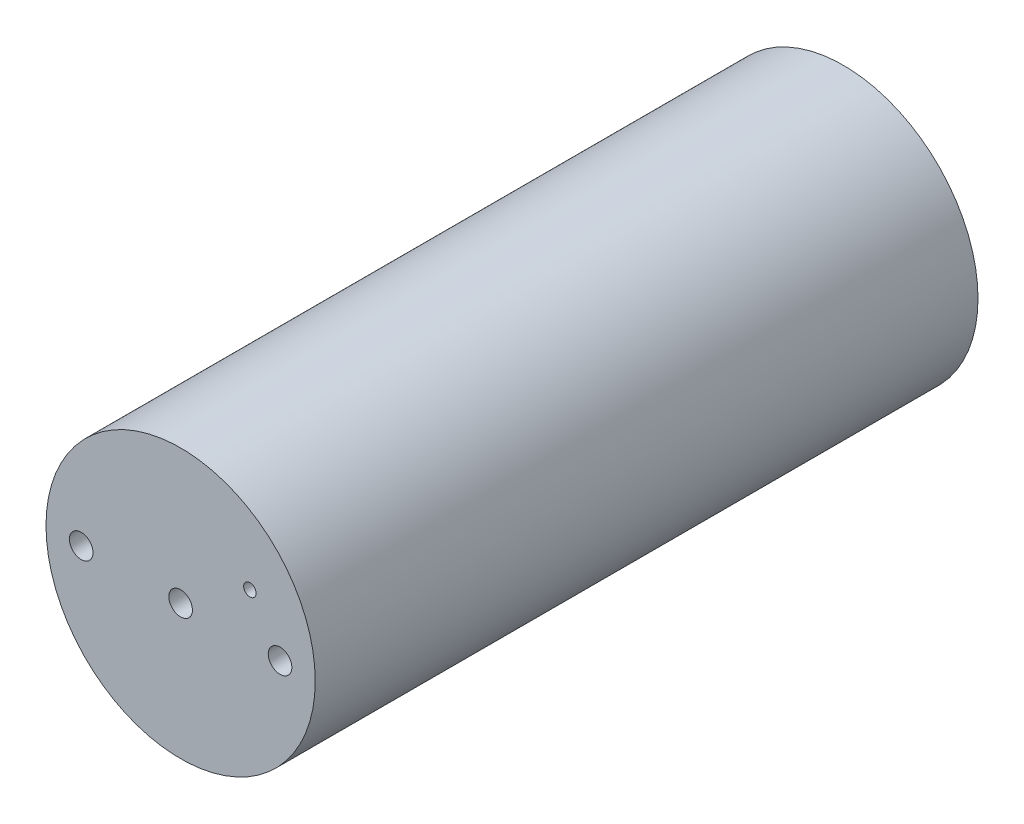
ISO-10303-21;
HEADER;
FILE_DESCRIPTION(('STEP AP214'),'2;1');
FILE_NAME('part.step','',(''),(''),'','','');
FILE_SCHEMA(('AUTOMOTIVE_DESIGN { 1 0 10303 214 1 1 1 1 }'));
ENDSEC;
DATA;
#1=APPLICATION_CONTEXT('core data for automotive mechanical design processes');
#2=APPLICATION_PROTOCOL_DEFINITION('international standard','automotive_design',2000,#1);
#3=PRODUCT_CONTEXT('',#1,'mechanical');
#4=PRODUCT('Part','Part','',(#3));
#5=PRODUCT_RELATED_PRODUCT_CATEGORY('part','',(#4));
#6=PRODUCT_DEFINITION_FORMATION('','',#4);
#7=PRODUCT_DEFINITION_CONTEXT('part definition',#1,'design');
#8=PRODUCT_DEFINITION('design','',#6,#7);
#9=PRODUCT_DEFINITION_SHAPE('','',#8);
#10=(LENGTH_UNIT() NAMED_UNIT(*) SI_UNIT(.MILLI.,.METRE.));
#11=(NAMED_UNIT(*) PLANE_ANGLE_UNIT() SI_UNIT($,.RADIAN.));
#12=(NAMED_UNIT(*) SI_UNIT($,.STERADIAN.) SOLID_ANGLE_UNIT());
#13=UNCERTAINTY_MEASURE_WITH_UNIT(LENGTH_MEASURE(1.E-05),#10,'distance_accuracy_value','');
#14=(GEOMETRIC_REPRESENTATION_CONTEXT(3) GLOBAL_UNCERTAINTY_ASSIGNED_CONTEXT((#13)) GLOBAL_UNIT_ASSIGNED_CONTEXT((#10,
#11,#12)) REPRESENTATION_CONTEXT('',''));
#15=CARTESIAN_POINT('',(0.,0.,0.));
#16=DIRECTION('',(0.,0.,1.));
#17=DIRECTION('',(1.,0.,0.));
#18=AXIS2_PLACEMENT_3D('',#15,#16,#17);
#19=CARTESIAN_POINT('',(0.,0.,203.2));
#20=DIRECTION('',(0.,0.,-1.));
#21=DIRECTION('',(-1.,0.,0.));
#22=AXIS2_PLACEMENT_3D('',#19,#20,#21);
#23=CYLINDRICAL_SURFACE('',#22,38.1);
#24=CARTESIAN_POINT('',(0.,0.,196.85));
#25=DIRECTION('',(0.,0.,1.));
#26=DIRECTION('',(1.,0.,0.));
#27=AXIS2_PLACEMENT_3D('',#24,#25,#26);
#28=CIRCLE('',#27,38.1);
#29=CARTESIAN_POINT('',(38.1,0.,196.85));
#30=VERTEX_POINT('',#29);
#31=EDGE_CURVE('E42',#30,#30,#28,.T.);
#32=ORIENTED_EDGE('',*,*,#31,.T.);
#33=EDGE_LOOP('',(#32));
#34=FACE_BOUND('',#33,.T.);
#35=CARTESIAN_POINT('',(0.,0.,6.35));
#36=DIRECTION('',(0.,0.,1.));
#37=DIRECTION('',(1.,0.,0.));
#38=AXIS2_PLACEMENT_3D('',#35,#36,#37);
#39=CIRCLE('',#38,38.1);
#40=CARTESIAN_POINT('',(38.1,0.,6.35));
#41=VERTEX_POINT('',#40);
#42=EDGE_CURVE('E68',#41,#41,#39,.T.);
#43=ORIENTED_EDGE('',*,*,#42,.F.);
#44=EDGE_LOOP('',(#43));
#45=FACE_BOUND('',#44,.T.);
#46=ADVANCED_FACE('F31',(#34,#45),#23,.F.);
#47=CARTESIAN_POINT('',(0.,0.,203.2));
#48=DIRECTION('',(0.,0.,1.));
#49=DIRECTION('',(1.,0.,0.));
#50=AXIS2_PLACEMENT_3D('',#47,#48,#49);
#51=PLANE('',#50);
#52=CARTESIAN_POINT('',(0.,0.,203.2));
#53=DIRECTION('',(0.,0.,1.));
#54=DIRECTION('',(1.,0.,0.));
#55=AXIS2_PLACEMENT_3D('',#52,#53,#54);
#56=CIRCLE('',#55,41.275);
#57=CARTESIAN_POINT('',(41.275,0.,203.2));
#58=VERTEX_POINT('',#57);
#59=EDGE_CURVE('E10',#58,#58,#56,.T.);
#60=ORIENTED_EDGE('',*,*,#59,.T.);
#61=EDGE_LOOP('',(#60));
#62=FACE_BOUND('',#61,.T.);
#63=CARTESIAN_POINT('',(30.48,0.,203.2));
#64=DIRECTION('',(0.,0.,1.));
#65=DIRECTION('',(-1.,0.,0.));
#66=AXIS2_PLACEMENT_3D('',#63,#64,#65);
#67=CIRCLE('',#66,3.6195);
#68=CARTESIAN_POINT('',(26.8605,0.,203.2));
#69=VERTEX_POINT('',#68);
#70=EDGE_CURVE('E65',#69,#69,#67,.T.);
#71=ORIENTED_EDGE('',*,*,#70,.F.);
#72=EDGE_LOOP('',(#71));
#73=FACE_BOUND('',#72,.T.);
#74=CARTESIAN_POINT('',(21.2319892144083,14.212140166392,203.2));
#75=DIRECTION('',(0.,0.,1.));
#76=DIRECTION('',(1.,0.,0.));
#77=AXIS2_PLACEMENT_3D('',#74,#75,#76);
#78=CIRCLE('',#77,1.905);
#79=CARTESIAN_POINT('',(23.1369892144083,14.212140166392,203.2));
#80=VERTEX_POINT('',#79);
#81=EDGE_CURVE('E59',#80,#80,#78,.T.);
#82=ORIENTED_EDGE('',*,*,#81,.F.);
#83=EDGE_LOOP('',(#82));
#84=FACE_BOUND('',#83,.T.);
#85=CARTESIAN_POINT('',(-30.48,0.,203.2));
#86=DIRECTION('',(0.,0.,1.));
#87=DIRECTION('',(1.,0.,0.));
#88=AXIS2_PLACEMENT_3D('',#85,#86,#87);
#89=CIRCLE('',#88,3.6195);
#90=CARTESIAN_POINT('',(-26.8605,0.,203.2));
#91=VERTEX_POINT('',#90);
#92=EDGE_CURVE('E53',#91,#91,#89,.T.);
#93=ORIENTED_EDGE('',*,*,#92,.F.);
#94=EDGE_LOOP('',(#93));
#95=FACE_BOUND('',#94,.T.);
#96=CARTESIAN_POINT('',(0.,0.,203.2));
#97=DIRECTION('',(0.,0.,1.));
#98=DIRECTION('',(1.,0.,0.));
#99=AXIS2_PLACEMENT_3D('',#96,#97,#98);
#100=CIRCLE('',#99,3.6195);
#101=CARTESIAN_POINT('',(3.6195,0.,203.2));
#102=VERTEX_POINT('',#101);
#103=EDGE_CURVE('E47',#102,#102,#100,.T.);
#104=ORIENTED_EDGE('',*,*,#103,.F.);
#105=EDGE_LOOP('',(#104));
#106=FACE_BOUND('',#105,.T.);
#107=ADVANCED_FACE('F119',(#62,#73,#84,#95,#106),#51,.T.);
#108=CARTESIAN_POINT('',(0.,0.,0.));
#109=DIRECTION('',(0.,0.,1.));
#110=DIRECTION('',(1.,0.,0.));
#111=AXIS2_PLACEMENT_3D('',#108,#109,#110);
#112=PLANE('',#111);
#113=CARTESIAN_POINT('',(0.,0.,0.));
#114=DIRECTION('',(0.,0.,1.));
#115=DIRECTION('',(1.,0.,0.));
#116=AXIS2_PLACEMENT_3D('',#113,#114,#115);
#117=CIRCLE('',#116,41.275);
#118=CARTESIAN_POINT('',(41.275,0.,0.));
#119=VERTEX_POINT('',#118);
#120=EDGE_CURVE('E35',#119,#119,#117,.T.);
#121=ORIENTED_EDGE('',*,*,#120,.F.);
#122=EDGE_LOOP('',(#121));
#123=FACE_BOUND('',#122,.T.);
#124=CARTESIAN_POINT('',(21.2319892144083,14.212140166392,0.));
#125=DIRECTION('',(0.,0.,1.));
#126=DIRECTION('',(1.,0.,0.));
#127=AXIS2_PLACEMENT_3D('',#124,#125,#126);
#128=CIRCLE('',#127,1.905);
#129=CARTESIAN_POINT('',(23.1369892144083,14.212140166392,0.));
#130=VERTEX_POINT('',#129);
#131=EDGE_CURVE('E86',#130,#130,#128,.T.);
#132=ORIENTED_EDGE('',*,*,#131,.T.);
#133=EDGE_LOOP('',(#132));
#134=FACE_BOUND('',#133,.T.);
#135=CARTESIAN_POINT('',(0.,0.,0.));
#136=DIRECTION('',(0.,0.,1.));
#137=DIRECTION('',(1.,0.,0.));
#138=AXIS2_PLACEMENT_3D('',#135,#136,#137);
#139=CIRCLE('',#138,3.6195);
#140=CARTESIAN_POINT('',(3.6195,0.,0.));
#141=VERTEX_POINT('',#140);
#142=EDGE_CURVE('E74',#141,#141,#139,.T.);
#143=ORIENTED_EDGE('',*,*,#142,.T.);
#144=EDGE_LOOP('',(#143));
#145=FACE_BOUND('',#144,.T.);
#146=CARTESIAN_POINT('',(-30.48,0.,0.));
#147=DIRECTION('',(0.,0.,1.));
#148=DIRECTION('',(1.,0.,0.));
#149=AXIS2_PLACEMENT_3D('',#146,#147,#148);
#150=CIRCLE('',#149,3.6195);
#151=CARTESIAN_POINT('',(-26.8605,0.,0.));
#152=VERTEX_POINT('',#151);
#153=EDGE_CURVE('E80',#152,#152,#150,.T.);
#154=ORIENTED_EDGE('',*,*,#153,.T.);
#155=EDGE_LOOP('',(#154));
#156=FACE_BOUND('',#155,.T.);
#157=CARTESIAN_POINT('',(30.48,0.,0.));
#158=DIRECTION('',(0.,0.,1.));
#159=DIRECTION('',(-1.,0.,0.));
#160=AXIS2_PLACEMENT_3D('',#157,#158,#159);
#161=CIRCLE('',#160,3.6195);
#162=CARTESIAN_POINT('',(26.8605,0.,0.));
#163=VERTEX_POINT('',#162);
#164=EDGE_CURVE('E92',#163,#163,#161,.T.);
#165=ORIENTED_EDGE('',*,*,#164,.T.);
#166=EDGE_LOOP('',(#165));
#167=FACE_BOUND('',#166,.T.);
#168=ADVANCED_FACE('F125',(#123,#134,#145,#156,#167),#112,.F.);
#169=CARTESIAN_POINT('',(0.,0.,203.2));
#170=DIRECTION('',(0.,0.,-1.));
#171=DIRECTION('',(-1.,0.,0.));
#172=AXIS2_PLACEMENT_3D('',#169,#170,#171);
#173=CYLINDRICAL_SURFACE('',#172,41.275);
#174=ORIENTED_EDGE('',*,*,#59,.F.);
#175=EDGE_LOOP('',(#174));
#176=FACE_BOUND('',#175,.T.);
#177=ORIENTED_EDGE('',*,*,#120,.T.);
#178=EDGE_LOOP('',(#177));
#179=FACE_BOUND('',#178,.T.);
#180=ADVANCED_FACE('F33',(#176,#179),#173,.T.);
#181=CARTESIAN_POINT('',(0.,0.,196.85));
#182=DIRECTION('',(0.,0.,1.));
#183=DIRECTION('',(1.,0.,0.));
#184=AXIS2_PLACEMENT_3D('',#181,#182,#183);
#185=PLANE('',#184);
#186=CARTESIAN_POINT('',(30.48,0.,196.85));
#187=DIRECTION('',(0.,0.,1.));
#188=DIRECTION('',(-1.,0.,0.));
#189=AXIS2_PLACEMENT_3D('',#186,#187,#188);
#190=CIRCLE('',#189,3.6195);
#191=CARTESIAN_POINT('',(26.8605,0.,196.85));
#192=VERTEX_POINT('',#191);
#193=EDGE_CURVE('E62',#192,#192,#190,.T.);
#194=ORIENTED_EDGE('',*,*,#193,.T.);
#195=EDGE_LOOP('',(#194));
#196=FACE_BOUND('',#195,.T.);
#197=CARTESIAN_POINT('',(21.2319892144083,14.212140166392,196.85));
#198=DIRECTION('',(0.,0.,1.));
#199=DIRECTION('',(1.,0.,0.));
#200=AXIS2_PLACEMENT_3D('',#197,#198,#199);
#201=CIRCLE('',#200,1.905);
#202=CARTESIAN_POINT('',(23.1369892144083,14.212140166392,196.85));
#203=VERTEX_POINT('',#202);
#204=EDGE_CURVE('E56',#203,#203,#201,.T.);
#205=ORIENTED_EDGE('',*,*,#204,.T.);
#206=EDGE_LOOP('',(#205));
#207=FACE_BOUND('',#206,.T.);
#208=CARTESIAN_POINT('',(-30.48,0.,196.85));
#209=DIRECTION('',(0.,0.,1.));
#210=DIRECTION('',(1.,0.,0.));
#211=AXIS2_PLACEMENT_3D('',#208,#209,#210);
#212=CIRCLE('',#211,3.6195);
#213=CARTESIAN_POINT('',(-26.8605,0.,196.85));
#214=VERTEX_POINT('',#213);
#215=EDGE_CURVE('E50',#214,#214,#212,.T.);
#216=ORIENTED_EDGE('',*,*,#215,.T.);
#217=EDGE_LOOP('',(#216));
#218=FACE_BOUND('',#217,.T.);
#219=CARTESIAN_POINT('',(0.,0.,196.85));
#220=DIRECTION('',(0.,0.,1.));
#221=DIRECTION('',(1.,0.,0.));
#222=AXIS2_PLACEMENT_3D('',#219,#220,#221);
#223=CIRCLE('',#222,3.6195);
#224=CARTESIAN_POINT('',(3.6195,0.,196.85));
#225=VERTEX_POINT('',#224);
#226=EDGE_CURVE('E46',#225,#225,#223,.T.);
#227=ORIENTED_EDGE('',*,*,#226,.T.);
#228=EDGE_LOOP('',(#227));
#229=FACE_BOUND('',#228,.T.);
#230=ORIENTED_EDGE('',*,*,#31,.F.);
#231=EDGE_LOOP('',(#230));
#232=FACE_BOUND('',#231,.T.);
#233=ADVANCED_FACE('F129',(#196,#207,#218,#229,#232),#185,.F.);
#234=CARTESIAN_POINT('',(0.,0.,196.85));
#235=DIRECTION('',(0.,0.,1.));
#236=DIRECTION('',(1.,0.,0.));
#237=AXIS2_PLACEMENT_3D('',#234,#235,#236);
#238=CYLINDRICAL_SURFACE('',#237,3.6195);
#239=ORIENTED_EDGE('',*,*,#226,.F.);
#240=EDGE_LOOP('',(#239));
#241=FACE_BOUND('',#240,.T.);
#242=ORIENTED_EDGE('',*,*,#103,.T.);
#243=EDGE_LOOP('',(#242));
#244=FACE_BOUND('',#243,.T.);
#245=ADVANCED_FACE('F222',(#241,#244),#238,.F.);
#246=CARTESIAN_POINT('',(-30.48,0.,196.85));
#247=DIRECTION('',(0.,0.,1.));
#248=DIRECTION('',(1.,0.,0.));
#249=AXIS2_PLACEMENT_3D('',#246,#247,#248);
#250=CYLINDRICAL_SURFACE('',#249,3.6195);
#251=ORIENTED_EDGE('',*,*,#215,.F.);
#252=EDGE_LOOP('',(#251));
#253=FACE_BOUND('',#252,.T.);
#254=ORIENTED_EDGE('',*,*,#92,.T.);
#255=EDGE_LOOP('',(#254));
#256=FACE_BOUND('',#255,.T.);
#257=ADVANCED_FACE('F213',(#253,#256),#250,.F.);
#258=CARTESIAN_POINT('',(21.2319892144083,14.212140166392,196.85));
#259=DIRECTION('',(0.,0.,1.));
#260=DIRECTION('',(1.,0.,0.));
#261=AXIS2_PLACEMENT_3D('',#258,#259,#260);
#262=CYLINDRICAL_SURFACE('',#261,1.905);
#263=ORIENTED_EDGE('',*,*,#204,.F.);
#264=EDGE_LOOP('',(#263));
#265=FACE_BOUND('',#264,.T.);
#266=ORIENTED_EDGE('',*,*,#81,.T.);
#267=EDGE_LOOP('',(#266));
#268=FACE_BOUND('',#267,.T.);
#269=ADVANCED_FACE('F114',(#265,#268),#262,.F.);
#270=CARTESIAN_POINT('',(30.48,0.,196.85));
#271=DIRECTION('',(0.,0.,1.));
#272=DIRECTION('',(1.,0.,0.));
#273=AXIS2_PLACEMENT_3D('',#270,#271,#272);
#274=CYLINDRICAL_SURFACE('',#273,3.6195);
#275=ORIENTED_EDGE('',*,*,#193,.F.);
#276=EDGE_LOOP('',(#275));
#277=FACE_BOUND('',#276,.T.);
#278=ORIENTED_EDGE('',*,*,#70,.T.);
#279=EDGE_LOOP('',(#278));
#280=FACE_BOUND('',#279,.T.);
#281=ADVANCED_FACE('F104',(#277,#280),#274,.F.);
#282=CARTESIAN_POINT('',(0.,0.,6.35));
#283=DIRECTION('',(0.,0.,-1.));
#284=DIRECTION('',(1.,0.,0.));
#285=AXIS2_PLACEMENT_3D('',#282,#283,#284);
#286=PLANE('',#285);
#287=ORIENTED_EDGE('',*,*,#42,.T.);
#288=EDGE_LOOP('',(#287));
#289=FACE_BOUND('',#288,.T.);
#290=CARTESIAN_POINT('',(0.,0.,6.35));
#291=DIRECTION('',(0.,0.,1.));
#292=DIRECTION('',(1.,0.,0.));
#293=AXIS2_PLACEMENT_3D('',#290,#291,#292);
#294=CIRCLE('',#293,3.6195);
#295=CARTESIAN_POINT('',(3.6195,0.,6.35));
#296=VERTEX_POINT('',#295);
#297=EDGE_CURVE('E73',#296,#296,#294,.T.);
#298=ORIENTED_EDGE('',*,*,#297,.F.);
#299=EDGE_LOOP('',(#298));
#300=FACE_BOUND('',#299,.T.);
#301=CARTESIAN_POINT('',(-30.48,0.,6.35));
#302=DIRECTION('',(0.,0.,1.));
#303=DIRECTION('',(1.,0.,0.));
#304=AXIS2_PLACEMENT_3D('',#301,#302,#303);
#305=CIRCLE('',#304,3.6195);
#306=CARTESIAN_POINT('',(-26.8605,0.,6.35));
#307=VERTEX_POINT('',#306);
#308=EDGE_CURVE('E77',#307,#307,#305,.T.);
#309=ORIENTED_EDGE('',*,*,#308,.F.);
#310=EDGE_LOOP('',(#309));
#311=FACE_BOUND('',#310,.T.);
#312=CARTESIAN_POINT('',(21.2319892144083,14.212140166392,6.35));
#313=DIRECTION('',(0.,0.,1.));
#314=DIRECTION('',(1.,0.,0.));
#315=AXIS2_PLACEMENT_3D('',#312,#313,#314);
#316=CIRCLE('',#315,1.905);
#317=CARTESIAN_POINT('',(23.1369892144083,14.212140166392,6.35));
#318=VERTEX_POINT('',#317);
#319=EDGE_CURVE('E83',#318,#318,#316,.T.);
#320=ORIENTED_EDGE('',*,*,#319,.F.);
#321=EDGE_LOOP('',(#320));
#322=FACE_BOUND('',#321,.T.);
#323=CARTESIAN_POINT('',(30.48,0.,6.35));
#324=DIRECTION('',(0.,0.,1.));
#325=DIRECTION('',(-1.,0.,0.));
#326=AXIS2_PLACEMENT_3D('',#323,#324,#325);
#327=CIRCLE('',#326,3.6195);
#328=CARTESIAN_POINT('',(26.8605,0.,6.35));
#329=VERTEX_POINT('',#328);
#330=EDGE_CURVE('E89',#329,#329,#327,.T.);
#331=ORIENTED_EDGE('',*,*,#330,.F.);
#332=EDGE_LOOP('',(#331));
#333=FACE_BOUND('',#332,.T.);
#334=ADVANCED_FACE('F101',(#289,#300,#311,#322,#333),#286,.F.);
#335=CARTESIAN_POINT('',(0.,0.,6.35));
#336=DIRECTION('',(0.,0.,-1.));
#337=DIRECTION('',(-1.,0.,0.));
#338=AXIS2_PLACEMENT_3D('',#335,#336,#337);
#339=CYLINDRICAL_SURFACE('',#338,3.6195);
#340=ORIENTED_EDGE('',*,*,#297,.T.);
#341=EDGE_LOOP('',(#340));
#342=FACE_BOUND('',#341,.T.);
#343=ORIENTED_EDGE('',*,*,#142,.F.);
#344=EDGE_LOOP('',(#343));
#345=FACE_BOUND('',#344,.T.);
#346=ADVANCED_FACE('F103',(#342,#345),#339,.F.);
#347=CARTESIAN_POINT('',(-30.48,0.,6.35));
#348=DIRECTION('',(0.,0.,-1.));
#349=DIRECTION('',(-1.,0.,0.));
#350=AXIS2_PLACEMENT_3D('',#347,#348,#349);
#351=CYLINDRICAL_SURFACE('',#350,3.6195);
#352=ORIENTED_EDGE('',*,*,#308,.T.);
#353=EDGE_LOOP('',(#352));
#354=FACE_BOUND('',#353,.T.);
#355=ORIENTED_EDGE('',*,*,#153,.F.);
#356=EDGE_LOOP('',(#355));
#357=FACE_BOUND('',#356,.T.);
#358=ADVANCED_FACE('F111',(#354,#357),#351,.F.);
#359=CARTESIAN_POINT('',(21.2319892144083,14.212140166392,6.35));
#360=DIRECTION('',(0.,0.,-1.));
#361=DIRECTION('',(-1.,0.,0.));
#362=AXIS2_PLACEMENT_3D('',#359,#360,#361);
#363=CYLINDRICAL_SURFACE('',#362,1.905);
#364=ORIENTED_EDGE('',*,*,#319,.T.);
#365=EDGE_LOOP('',(#364));
#366=FACE_BOUND('',#365,.T.);
#367=ORIENTED_EDGE('',*,*,#131,.F.);
#368=EDGE_LOOP('',(#367));
#369=FACE_BOUND('',#368,.T.);
#370=ADVANCED_FACE('F147',(#366,#369),#363,.F.);
#371=CARTESIAN_POINT('',(30.48,0.,6.35));
#372=DIRECTION('',(0.,0.,-1.));
#373=DIRECTION('',(-1.,0.,0.));
#374=AXIS2_PLACEMENT_3D('',#371,#372,#373);
#375=CYLINDRICAL_SURFACE('',#374,3.6195);
#376=ORIENTED_EDGE('',*,*,#330,.T.);
#377=EDGE_LOOP('',(#376));
#378=FACE_BOUND('',#377,.T.);
#379=ORIENTED_EDGE('',*,*,#164,.F.);
#380=EDGE_LOOP('',(#379));
#381=FACE_BOUND('',#380,.T.);
#382=ADVANCED_FACE('F98',(#378,#381),#375,.F.);
#383=CLOSED_SHELL('',(#46,#107,#168,#180,#233,#245,#257,#269,#281,#334,#346,#358,#370,#382));
#384=MANIFOLD_SOLID_BREP('B2',#383);
#385=ADVANCED_BREP_SHAPE_REPRESENTATION('',(#18,#384),#14);
#386=SHAPE_DEFINITION_REPRESENTATION(#9,#385);
ENDSEC;
END-ISO-10303-21;
